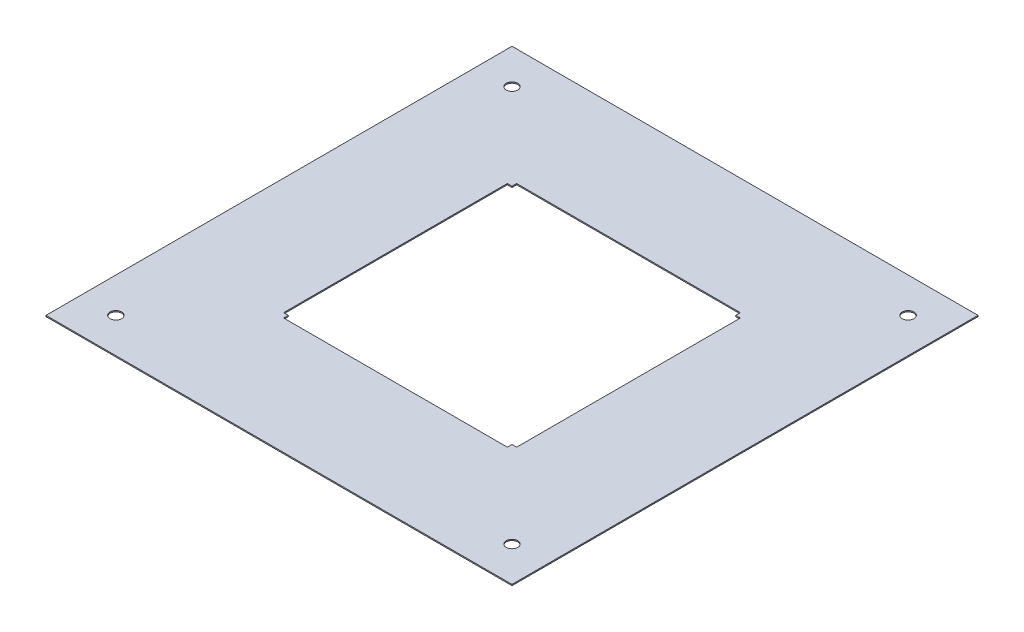
ISO-10303-21;
HEADER;
FILE_DESCRIPTION(('STEP AP214'),'2;1');
FILE_NAME('part.step','',(''),(''),'','','');
FILE_SCHEMA(('AUTOMOTIVE_DESIGN { 1 0 10303 214 1 1 1 1 }'));
ENDSEC;
DATA;
#1=APPLICATION_CONTEXT('core data for automotive mechanical design processes');
#2=APPLICATION_PROTOCOL_DEFINITION('international standard','automotive_design',2000,#1);
#3=PRODUCT_CONTEXT('',#1,'mechanical');
#4=PRODUCT('Part','Part','',(#3));
#5=PRODUCT_RELATED_PRODUCT_CATEGORY('part','',(#4));
#6=PRODUCT_DEFINITION_FORMATION('','',#4);
#7=PRODUCT_DEFINITION_CONTEXT('part definition',#1,'design');
#8=PRODUCT_DEFINITION('design','',#6,#7);
#9=PRODUCT_DEFINITION_SHAPE('','',#8);
#10=(LENGTH_UNIT() NAMED_UNIT(*) SI_UNIT(.MILLI.,.METRE.));
#11=(NAMED_UNIT(*) PLANE_ANGLE_UNIT() SI_UNIT($,.RADIAN.));
#12=(NAMED_UNIT(*) SI_UNIT($,.STERADIAN.) SOLID_ANGLE_UNIT());
#13=UNCERTAINTY_MEASURE_WITH_UNIT(LENGTH_MEASURE(1.E-05),#10,'distance_accuracy_value','');
#14=(GEOMETRIC_REPRESENTATION_CONTEXT(3) GLOBAL_UNCERTAINTY_ASSIGNED_CONTEXT((#13)) GLOBAL_UNIT_ASSIGNED_CONTEXT((#10,
#11,#12)) REPRESENTATION_CONTEXT('',''));
#15=CARTESIAN_POINT('',(0.,0.,0.));
#16=DIRECTION('',(0.,0.,1.));
#17=DIRECTION('',(1.,0.,0.));
#18=AXIS2_PLACEMENT_3D('',#15,#16,#17);
#19=CARTESIAN_POINT('',(0.,0.5,0.));
#20=DIRECTION('',(0.,-1.,0.));
#21=DIRECTION('',(0.,0.,-1.));
#22=AXIS2_PLACEMENT_3D('',#19,#20,#21);
#23=PLANE('',#22);
#24=DIRECTION('',(-1.,0.,0.));
#25=VECTOR('',#24,1.);
#26=CARTESIAN_POINT('',(50.,0.5,-148.));
#27=LINE('',#26,#25);
#28=CARTESIAN_POINT('',(52.,0.5,-148.));
#29=VERTEX_POINT('',#28);
#30=CARTESIAN_POINT('',(50.,0.5,-148.));
#31=VERTEX_POINT('',#30);
#32=EDGE_CURVE('E157',#29,#31,#27,.T.);
#33=ORIENTED_EDGE('',*,*,#32,.F.);
#34=DIRECTION('',(0.,0.,1.));
#35=VECTOR('',#34,1.);
#36=CARTESIAN_POINT('',(52.,0.5,-150.));
#37=LINE('',#36,#35);
#38=CARTESIAN_POINT('',(52.,0.5,-150.));
#39=VERTEX_POINT('',#38);
#40=EDGE_CURVE('E48',#39,#29,#37,.T.);
#41=ORIENTED_EDGE('',*,*,#40,.F.);
#42=DIRECTION('',(-1.,0.,0.));
#43=VECTOR('',#42,1.);
#44=CARTESIAN_POINT('',(52.,0.5,-150.));
#45=LINE('',#44,#43);
#46=CARTESIAN_POINT('',(148.,0.5,-150.));
#47=VERTEX_POINT('',#46);
#48=EDGE_CURVE('E190',#47,#39,#45,.T.);
#49=ORIENTED_EDGE('',*,*,#48,.F.);
#50=DIRECTION('',(0.,0.,-1.));
#51=VECTOR('',#50,1.);
#52=CARTESIAN_POINT('',(148.,0.5,-150.));
#53=LINE('',#52,#51);
#54=CARTESIAN_POINT('',(148.,0.5,-148.));
#55=VERTEX_POINT('',#54);
#56=EDGE_CURVE('E187',#55,#47,#53,.T.);
#57=ORIENTED_EDGE('',*,*,#56,.F.);
#58=DIRECTION('',(-1.,0.,0.));
#59=VECTOR('',#58,1.);
#60=CARTESIAN_POINT('',(150.,0.5,-148.));
#61=LINE('',#60,#59);
#62=CARTESIAN_POINT('',(150.,0.5,-148.));
#63=VERTEX_POINT('',#62);
#64=EDGE_CURVE('E184',#63,#55,#61,.T.);
#65=ORIENTED_EDGE('',*,*,#64,.F.);
#66=DIRECTION('',(0.,0.,-1.));
#67=VECTOR('',#66,1.);
#68=CARTESIAN_POINT('',(150.,0.5,-148.));
#69=LINE('',#68,#67);
#70=CARTESIAN_POINT('',(150.,0.5,-52.));
#71=VERTEX_POINT('',#70);
#72=EDGE_CURVE('E181',#71,#63,#69,.T.);
#73=ORIENTED_EDGE('',*,*,#72,.F.);
#74=DIRECTION('',(1.,0.,0.));
#75=VECTOR('',#74,1.);
#76=CARTESIAN_POINT('',(150.,0.5,-52.));
#77=LINE('',#76,#75);
#78=CARTESIAN_POINT('',(148.,0.5,-52.));
#79=VERTEX_POINT('',#78);
#80=EDGE_CURVE('E178',#79,#71,#77,.T.);
#81=ORIENTED_EDGE('',*,*,#80,.F.);
#82=DIRECTION('',(0.,0.,-1.));
#83=VECTOR('',#82,1.);
#84=CARTESIAN_POINT('',(148.,0.5,-50.));
#85=LINE('',#84,#83);
#86=CARTESIAN_POINT('',(148.,0.5,-50.));
#87=VERTEX_POINT('',#86);
#88=EDGE_CURVE('E175',#87,#79,#85,.T.);
#89=ORIENTED_EDGE('',*,*,#88,.F.);
#90=DIRECTION('',(1.,0.,0.));
#91=VECTOR('',#90,1.);
#92=CARTESIAN_POINT('',(148.,0.5,-50.));
#93=LINE('',#92,#91);
#94=CARTESIAN_POINT('',(52.,0.5,-49.9999999999992));
#95=VERTEX_POINT('',#94);
#96=EDGE_CURVE('E172',#95,#87,#93,.T.);
#97=ORIENTED_EDGE('',*,*,#96,.F.);
#98=DIRECTION('',(0.,0.,1.));
#99=VECTOR('',#98,1.);
#100=CARTESIAN_POINT('',(52.,0.5,-49.9999999999992));
#101=LINE('',#100,#99);
#102=CARTESIAN_POINT('',(52.,0.5,-51.9999999999992));
#103=VERTEX_POINT('',#102);
#104=EDGE_CURVE('E166',#103,#95,#101,.T.);
#105=ORIENTED_EDGE('',*,*,#104,.F.);
#106=DIRECTION('',(1.,0.,0.));
#107=VECTOR('',#106,1.);
#108=CARTESIAN_POINT('',(50.,0.5,-51.9999999999992));
#109=LINE('',#108,#107);
#110=CARTESIAN_POINT('',(50.,0.5,-51.9999999999992));
#111=VERTEX_POINT('',#110);
#112=EDGE_CURVE('E164',#111,#103,#109,.T.);
#113=ORIENTED_EDGE('',*,*,#112,.F.);
#114=DIRECTION('',(0.,0.,1.));
#115=VECTOR('',#114,1.);
#116=CARTESIAN_POINT('',(50.,0.5,-51.9999999999992));
#117=LINE('',#116,#115);
#118=EDGE_CURVE('E148',#31,#111,#117,.T.);
#119=ORIENTED_EDGE('',*,*,#118,.F.);
#120=EDGE_LOOP('',(#33,#41,#49,#57,#65,#73,#81,#89,#97,#105,#113,#119));
#121=FACE_BOUND('',#120,.T.);
#122=DIRECTION('',(0.,0.,1.));
#123=VECTOR('',#122,1.);
#124=CARTESIAN_POINT('',(0.,0.5,0.));
#125=LINE('',#124,#123);
#126=CARTESIAN_POINT('',(0.,0.5,-200.));
#127=VERTEX_POINT('',#126);
#128=CARTESIAN_POINT('',(0.,0.5,0.));
#129=VERTEX_POINT('',#128);
#130=EDGE_CURVE('E238',#127,#129,#125,.T.);
#131=ORIENTED_EDGE('',*,*,#130,.T.);
#132=DIRECTION('',(1.,0.,0.));
#133=VECTOR('',#132,1.);
#134=CARTESIAN_POINT('',(0.,0.5,0.));
#135=LINE('',#134,#133);
#136=CARTESIAN_POINT('',(200.,0.5,0.));
#137=VERTEX_POINT('',#136);
#138=EDGE_CURVE('E241',#129,#137,#135,.T.);
#139=ORIENTED_EDGE('',*,*,#138,.T.);
#140=DIRECTION('',(0.,0.,-1.));
#141=VECTOR('',#140,1.);
#142=CARTESIAN_POINT('',(200.,0.5,0.));
#143=LINE('',#142,#141);
#144=CARTESIAN_POINT('',(200.,0.5,-200.));
#145=VERTEX_POINT('',#144);
#146=EDGE_CURVE('E244',#137,#145,#143,.T.);
#147=ORIENTED_EDGE('',*,*,#146,.T.);
#148=DIRECTION('',(-1.,0.,0.));
#149=VECTOR('',#148,1.);
#150=CARTESIAN_POINT('',(0.,0.5,-200.));
#151=LINE('',#150,#149);
#152=EDGE_CURVE('E246',#145,#127,#151,.T.);
#153=ORIENTED_EDGE('',*,*,#152,.T.);
#154=EDGE_LOOP('',(#131,#139,#147,#153));
#155=FACE_BOUND('',#154,.T.);
#156=CARTESIAN_POINT('',(15.,0.5,-185.));
#157=DIRECTION('',(0.,1.,0.));
#158=DIRECTION('',(0.,0.,1.));
#159=AXIS2_PLACEMENT_3D('',#156,#157,#158);
#160=CIRCLE('',#159,2.5);
#161=CARTESIAN_POINT('',(15.,0.5,-182.5));
#162=VERTEX_POINT('',#161);
#163=EDGE_CURVE('E232',#162,#162,#160,.T.);
#164=ORIENTED_EDGE('',*,*,#163,.F.);
#165=EDGE_LOOP('',(#164));
#166=FACE_BOUND('',#165,.T.);
#167=CARTESIAN_POINT('',(185.,0.5,-185.));
#168=DIRECTION('',(0.,1.,0.));
#169=DIRECTION('',(0.,0.,1.));
#170=AXIS2_PLACEMENT_3D('',#167,#168,#169);
#171=CIRCLE('',#170,2.5);
#172=CARTESIAN_POINT('',(185.,0.5,-182.5));
#173=VERTEX_POINT('',#172);
#174=EDGE_CURVE('E226',#173,#173,#171,.T.);
#175=ORIENTED_EDGE('',*,*,#174,.F.);
#176=EDGE_LOOP('',(#175));
#177=FACE_BOUND('',#176,.T.);
#178=CARTESIAN_POINT('',(185.,0.5,-15.0000000000001));
#179=DIRECTION('',(0.,1.,0.));
#180=DIRECTION('',(0.,0.,1.));
#181=AXIS2_PLACEMENT_3D('',#178,#179,#180);
#182=CIRCLE('',#181,2.5);
#183=CARTESIAN_POINT('',(185.,0.5,-12.5000000000001));
#184=VERTEX_POINT('',#183);
#185=EDGE_CURVE('E220',#184,#184,#182,.T.);
#186=ORIENTED_EDGE('',*,*,#185,.F.);
#187=EDGE_LOOP('',(#186));
#188=FACE_BOUND('',#187,.T.);
#189=CARTESIAN_POINT('',(15.,0.5,-15.));
#190=DIRECTION('',(0.,1.,0.));
#191=DIRECTION('',(0.,0.,1.));
#192=AXIS2_PLACEMENT_3D('',#189,#190,#191);
#193=CIRCLE('',#192,2.5);
#194=CARTESIAN_POINT('',(15.,0.5,-12.5));
#195=VERTEX_POINT('',#194);
#196=EDGE_CURVE('E214',#195,#195,#193,.T.);
#197=ORIENTED_EDGE('',*,*,#196,.F.);
#198=EDGE_LOOP('',(#197));
#199=FACE_BOUND('',#198,.T.);
#200=ADVANCED_FACE('F33',(#121,#155,#166,#177,#188,#199),#23,.F.);
#201=CARTESIAN_POINT('',(0.,0.,0.));
#202=DIRECTION('',(0.,-1.,0.));
#203=DIRECTION('',(0.,0.,-1.));
#204=AXIS2_PLACEMENT_3D('',#201,#202,#203);
#205=PLANE('',#204);
#206=DIRECTION('',(0.,0.,-1.));
#207=VECTOR('',#206,1.);
#208=CARTESIAN_POINT('',(51.9999999999989,0.,3.60822483003168E-13));
#209=LINE('',#208,#207);
#210=CARTESIAN_POINT('',(52.,0.,-148.));
#211=VERTEX_POINT('',#210);
#212=CARTESIAN_POINT('',(52.,0.,-150.));
#213=VERTEX_POINT('',#212);
#214=EDGE_CURVE('E11',#211,#213,#209,.T.);
#215=ORIENTED_EDGE('',*,*,#214,.F.);
#216=DIRECTION('',(1.,0.,0.));
#217=VECTOR('',#216,1.);
#218=CARTESIAN_POINT('',(0.,0.,-148.));
#219=LINE('',#218,#217);
#220=CARTESIAN_POINT('',(50.,0.,-148.));
#221=VERTEX_POINT('',#220);
#222=EDGE_CURVE('E267',#221,#211,#219,.T.);
#223=ORIENTED_EDGE('',*,*,#222,.F.);
#224=DIRECTION('',(0.,0.,-1.));
#225=VECTOR('',#224,1.);
#226=CARTESIAN_POINT('',(50.0000000000001,0.,0.));
#227=LINE('',#226,#225);
#228=CARTESIAN_POINT('',(50.,0.,-51.9999999999992));
#229=VERTEX_POINT('',#228);
#230=EDGE_CURVE('E151',#229,#221,#227,.T.);
#231=ORIENTED_EDGE('',*,*,#230,.F.);
#232=DIRECTION('',(-1.,0.,0.));
#233=VECTOR('',#232,1.);
#234=CARTESIAN_POINT('',(0.,0.,-51.9999999999992));
#235=LINE('',#234,#233);
#236=CARTESIAN_POINT('',(52.,0.,-51.9999999999992));
#237=VERTEX_POINT('',#236);
#238=EDGE_CURVE('E270',#237,#229,#235,.T.);
#239=ORIENTED_EDGE('',*,*,#238,.F.);
#240=DIRECTION('',(0.,0.,-1.));
#241=VECTOR('',#240,1.);
#242=CARTESIAN_POINT('',(52.,0.,0.));
#243=LINE('',#242,#241);
#244=CARTESIAN_POINT('',(52.,0.,-49.9999999999992));
#245=VERTEX_POINT('',#244);
#246=EDGE_CURVE('E272',#245,#237,#243,.T.);
#247=ORIENTED_EDGE('',*,*,#246,.F.);
#248=DIRECTION('',(-1.,0.,0.));
#249=VECTOR('',#248,1.);
#250=CARTESIAN_POINT('',(0.,0.,-50.));
#251=LINE('',#250,#249);
#252=CARTESIAN_POINT('',(148.,0.,-50.));
#253=VERTEX_POINT('',#252);
#254=EDGE_CURVE('E274',#253,#245,#251,.T.);
#255=ORIENTED_EDGE('',*,*,#254,.F.);
#256=DIRECTION('',(0.,0.,1.));
#257=VECTOR('',#256,1.);
#258=CARTESIAN_POINT('',(147.999999999999,0.,2.05391259555653E-12));
#259=LINE('',#258,#257);
#260=CARTESIAN_POINT('',(148.,0.,-52.));
#261=VERTEX_POINT('',#260);
#262=EDGE_CURVE('E276',#261,#253,#259,.T.);
#263=ORIENTED_EDGE('',*,*,#262,.F.);
#264=DIRECTION('',(-1.,0.,0.));
#265=VECTOR('',#264,1.);
#266=CARTESIAN_POINT('',(0.,0.,-52.));
#267=LINE('',#266,#265);
#268=CARTESIAN_POINT('',(150.,0.,-52.));
#269=VERTEX_POINT('',#268);
#270=EDGE_CURVE('E278',#269,#261,#267,.T.);
#271=ORIENTED_EDGE('',*,*,#270,.F.);
#272=DIRECTION('',(0.,0.,1.));
#273=VECTOR('',#272,1.);
#274=CARTESIAN_POINT('',(150.,0.,-1.73472347597681E-13));
#275=LINE('',#274,#273);
#276=CARTESIAN_POINT('',(150.,0.,-148.));
#277=VERTEX_POINT('',#276);
#278=EDGE_CURVE('E280',#277,#269,#275,.T.);
#279=ORIENTED_EDGE('',*,*,#278,.F.);
#280=DIRECTION('',(1.,0.,0.));
#281=VECTOR('',#280,1.);
#282=CARTESIAN_POINT('',(2.05391259555657E-12,0.,-148.000000000002));
#283=LINE('',#282,#281);
#284=CARTESIAN_POINT('',(148.,0.,-148.));
#285=VERTEX_POINT('',#284);
#286=EDGE_CURVE('E282',#285,#277,#283,.T.);
#287=ORIENTED_EDGE('',*,*,#286,.F.);
#288=DIRECTION('',(0.,0.,1.));
#289=VECTOR('',#288,1.);
#290=CARTESIAN_POINT('',(148.,0.,0.));
#291=LINE('',#290,#289);
#292=CARTESIAN_POINT('',(148.,0.,-150.));
#293=VERTEX_POINT('',#292);
#294=EDGE_CURVE('E284',#293,#285,#291,.T.);
#295=ORIENTED_EDGE('',*,*,#294,.F.);
#296=DIRECTION('',(1.,0.,0.));
#297=VECTOR('',#296,1.);
#298=CARTESIAN_POINT('',(-1.73472347597681E-13,0.,-150.));
#299=LINE('',#298,#297);
#300=EDGE_CURVE('E41',#213,#293,#299,.T.);
#301=ORIENTED_EDGE('',*,*,#300,.F.);
#302=EDGE_LOOP('',(#215,#223,#231,#239,#247,#255,#263,#271,#279,#287,#295,#301));
#303=FACE_BOUND('',#302,.T.);
#304=CARTESIAN_POINT('',(185.,0.,-15.0000000000001));
#305=DIRECTION('',(0.,1.,0.));
#306=DIRECTION('',(0.,0.,1.));
#307=AXIS2_PLACEMENT_3D('',#304,#305,#306);
#308=CIRCLE('',#307,2.5);
#309=CARTESIAN_POINT('',(185.,0.,-12.5000000000001));
#310=VERTEX_POINT('',#309);
#311=EDGE_CURVE('E217',#310,#310,#308,.T.);
#312=ORIENTED_EDGE('',*,*,#311,.T.);
#313=EDGE_LOOP('',(#312));
#314=FACE_BOUND('',#313,.T.);
#315=CARTESIAN_POINT('',(15.,0.,-185.));
#316=DIRECTION('',(0.,1.,0.));
#317=DIRECTION('',(0.,0.,1.));
#318=AXIS2_PLACEMENT_3D('',#315,#316,#317);
#319=CIRCLE('',#318,2.5);
#320=CARTESIAN_POINT('',(15.,0.,-182.5));
#321=VERTEX_POINT('',#320);
#322=EDGE_CURVE('E229',#321,#321,#319,.T.);
#323=ORIENTED_EDGE('',*,*,#322,.T.);
#324=EDGE_LOOP('',(#323));
#325=FACE_BOUND('',#324,.T.);
#326=DIRECTION('',(0.,0.,1.));
#327=VECTOR('',#326,1.);
#328=CARTESIAN_POINT('',(0.,0.,0.));
#329=LINE('',#328,#327);
#330=CARTESIAN_POINT('',(0.,0.,-200.));
#331=VERTEX_POINT('',#330);
#332=CARTESIAN_POINT('',(0.,0.,0.));
#333=VERTEX_POINT('',#332);
#334=EDGE_CURVE('E235',#331,#333,#329,.T.);
#335=ORIENTED_EDGE('',*,*,#334,.F.);
#336=DIRECTION('',(-1.,0.,0.));
#337=VECTOR('',#336,1.);
#338=CARTESIAN_POINT('',(0.,0.,-200.));
#339=LINE('',#338,#337);
#340=CARTESIAN_POINT('',(200.,0.,-200.));
#341=VERTEX_POINT('',#340);
#342=EDGE_CURVE('E242',#341,#331,#339,.T.);
#343=ORIENTED_EDGE('',*,*,#342,.F.);
#344=DIRECTION('',(0.,0.,-1.));
#345=VECTOR('',#344,1.);
#346=CARTESIAN_POINT('',(200.,0.,0.));
#347=LINE('',#346,#345);
#348=CARTESIAN_POINT('',(200.,0.,0.));
#349=VERTEX_POINT('',#348);
#350=EDGE_CURVE('E253',#349,#341,#347,.T.);
#351=ORIENTED_EDGE('',*,*,#350,.F.);
#352=DIRECTION('',(1.,0.,0.));
#353=VECTOR('',#352,1.);
#354=CARTESIAN_POINT('',(0.,0.,0.));
#355=LINE('',#354,#353);
#356=EDGE_CURVE('E251',#333,#349,#355,.T.);
#357=ORIENTED_EDGE('',*,*,#356,.F.);
#358=EDGE_LOOP('',(#335,#343,#351,#357));
#359=FACE_BOUND('',#358,.T.);
#360=CARTESIAN_POINT('',(185.,0.,-185.));
#361=DIRECTION('',(0.,1.,0.));
#362=DIRECTION('',(0.,0.,1.));
#363=AXIS2_PLACEMENT_3D('',#360,#361,#362);
#364=CIRCLE('',#363,2.5);
#365=CARTESIAN_POINT('',(185.,0.,-182.5));
#366=VERTEX_POINT('',#365);
#367=EDGE_CURVE('E223',#366,#366,#364,.T.);
#368=ORIENTED_EDGE('',*,*,#367,.T.);
#369=EDGE_LOOP('',(#368));
#370=FACE_BOUND('',#369,.T.);
#371=CARTESIAN_POINT('',(15.,0.,-15.));
#372=DIRECTION('',(0.,1.,0.));
#373=DIRECTION('',(0.,0.,1.));
#374=AXIS2_PLACEMENT_3D('',#371,#372,#373);
#375=CIRCLE('',#374,2.5);
#376=CARTESIAN_POINT('',(15.,0.,-12.5));
#377=VERTEX_POINT('',#376);
#378=EDGE_CURVE('E195',#377,#377,#375,.T.);
#379=ORIENTED_EDGE('',*,*,#378,.T.);
#380=EDGE_LOOP('',(#379));
#381=FACE_BOUND('',#380,.T.);
#382=ADVANCED_FACE('F299',(#303,#314,#325,#359,#370,#381),#205,.T.);
#383=CARTESIAN_POINT('',(0.,0.5,0.));
#384=DIRECTION('',(1.,0.,0.));
#385=DIRECTION('',(0.,0.,-1.));
#386=AXIS2_PLACEMENT_3D('',#383,#384,#385);
#387=PLANE('',#386);
#388=ORIENTED_EDGE('',*,*,#334,.T.);
#389=DIRECTION('',(0.,-1.,0.));
#390=VECTOR('',#389,1.);
#391=CARTESIAN_POINT('',(0.,0.5,0.));
#392=LINE('',#391,#390);
#393=EDGE_CURVE('E264',#129,#333,#392,.T.);
#394=ORIENTED_EDGE('',*,*,#393,.F.);
#395=ORIENTED_EDGE('',*,*,#130,.F.);
#396=DIRECTION('',(0.,-1.,0.));
#397=VECTOR('',#396,1.);
#398=CARTESIAN_POINT('',(0.,0.5,-200.));
#399=LINE('',#398,#397);
#400=EDGE_CURVE('E248',#127,#331,#399,.T.);
#401=ORIENTED_EDGE('',*,*,#400,.T.);
#402=EDGE_LOOP('',(#388,#394,#395,#401));
#403=FACE_BOUND('',#402,.T.);
#404=ADVANCED_FACE('F35',(#403),#387,.F.);
#405=CARTESIAN_POINT('',(0.,0.5,0.));
#406=DIRECTION('',(0.,0.,-1.));
#407=DIRECTION('',(-1.,0.,0.));
#408=AXIS2_PLACEMENT_3D('',#405,#406,#407);
#409=PLANE('',#408);
#410=ORIENTED_EDGE('',*,*,#356,.T.);
#411=DIRECTION('',(0.,-1.,0.));
#412=VECTOR('',#411,1.);
#413=CARTESIAN_POINT('',(200.,0.5,0.));
#414=LINE('',#413,#412);
#415=EDGE_CURVE('E261',#137,#349,#414,.T.);
#416=ORIENTED_EDGE('',*,*,#415,.F.);
#417=ORIENTED_EDGE('',*,*,#138,.F.);
#418=ORIENTED_EDGE('',*,*,#393,.T.);
#419=EDGE_LOOP('',(#410,#416,#417,#418));
#420=FACE_BOUND('',#419,.T.);
#421=ADVANCED_FACE('F361',(#420),#409,.F.);
#422=CARTESIAN_POINT('',(200.,0.5,0.));
#423=DIRECTION('',(-1.,0.,0.));
#424=DIRECTION('',(0.,0.,1.));
#425=AXIS2_PLACEMENT_3D('',#422,#423,#424);
#426=PLANE('',#425);
#427=ORIENTED_EDGE('',*,*,#350,.T.);
#428=DIRECTION('',(0.,-1.,0.));
#429=VECTOR('',#428,1.);
#430=CARTESIAN_POINT('',(200.,0.5,-200.));
#431=LINE('',#430,#429);
#432=EDGE_CURVE('E258',#145,#341,#431,.T.);
#433=ORIENTED_EDGE('',*,*,#432,.F.);
#434=ORIENTED_EDGE('',*,*,#146,.F.);
#435=ORIENTED_EDGE('',*,*,#415,.T.);
#436=EDGE_LOOP('',(#427,#433,#434,#435));
#437=FACE_BOUND('',#436,.T.);
#438=ADVANCED_FACE('F358',(#437),#426,.F.);
#439=CARTESIAN_POINT('',(0.,0.5,-200.));
#440=DIRECTION('',(0.,0.,1.));
#441=DIRECTION('',(1.,0.,0.));
#442=AXIS2_PLACEMENT_3D('',#439,#440,#441);
#443=PLANE('',#442);
#444=ORIENTED_EDGE('',*,*,#342,.T.);
#445=ORIENTED_EDGE('',*,*,#400,.F.);
#446=ORIENTED_EDGE('',*,*,#152,.F.);
#447=ORIENTED_EDGE('',*,*,#432,.T.);
#448=EDGE_LOOP('',(#444,#445,#446,#447));
#449=FACE_BOUND('',#448,.T.);
#450=ADVANCED_FACE('F355',(#449),#443,.F.);
#451=CARTESIAN_POINT('',(15.,0.5,-185.));
#452=DIRECTION('',(0.,-1.,0.));
#453=DIRECTION('',(0.,0.,-1.));
#454=AXIS2_PLACEMENT_3D('',#451,#452,#453);
#455=CYLINDRICAL_SURFACE('',#454,2.5);
#456=ORIENTED_EDGE('',*,*,#163,.T.);
#457=EDGE_LOOP('',(#456));
#458=FACE_BOUND('',#457,.T.);
#459=ORIENTED_EDGE('',*,*,#322,.F.);
#460=EDGE_LOOP('',(#459));
#461=FACE_BOUND('',#460,.T.);
#462=ADVANCED_FACE('F352',(#458,#461),#455,.F.);
#463=CARTESIAN_POINT('',(185.,0.5,-185.));
#464=DIRECTION('',(0.,-1.,0.));
#465=DIRECTION('',(0.,0.,-1.));
#466=AXIS2_PLACEMENT_3D('',#463,#464,#465);
#467=CYLINDRICAL_SURFACE('',#466,2.5);
#468=ORIENTED_EDGE('',*,*,#174,.T.);
#469=EDGE_LOOP('',(#468));
#470=FACE_BOUND('',#469,.T.);
#471=ORIENTED_EDGE('',*,*,#367,.F.);
#472=EDGE_LOOP('',(#471));
#473=FACE_BOUND('',#472,.T.);
#474=ADVANCED_FACE('F395',(#470,#473),#467,.F.);
#475=CARTESIAN_POINT('',(185.,0.5,-15.0000000000001));
#476=DIRECTION('',(0.,-1.,0.));
#477=DIRECTION('',(0.,0.,-1.));
#478=AXIS2_PLACEMENT_3D('',#475,#476,#477);
#479=CYLINDRICAL_SURFACE('',#478,2.5);
#480=ORIENTED_EDGE('',*,*,#185,.T.);
#481=EDGE_LOOP('',(#480));
#482=FACE_BOUND('',#481,.T.);
#483=ORIENTED_EDGE('',*,*,#311,.F.);
#484=EDGE_LOOP('',(#483));
#485=FACE_BOUND('',#484,.T.);
#486=ADVANCED_FACE('F341',(#482,#485),#479,.F.);
#487=CARTESIAN_POINT('',(15.,0.5,-15.));
#488=DIRECTION('',(0.,-1.,0.));
#489=DIRECTION('',(0.,0.,-1.));
#490=AXIS2_PLACEMENT_3D('',#487,#488,#489);
#491=CYLINDRICAL_SURFACE('',#490,2.5);
#492=ORIENTED_EDGE('',*,*,#196,.T.);
#493=EDGE_LOOP('',(#492));
#494=FACE_BOUND('',#493,.T.);
#495=ORIENTED_EDGE('',*,*,#378,.F.);
#496=EDGE_LOOP('',(#495));
#497=FACE_BOUND('',#496,.T.);
#498=ADVANCED_FACE('F334',(#494,#497),#491,.F.);
#499=CARTESIAN_POINT('',(52.,-9.5,-150.));
#500=DIRECTION('',(-1.,0.,0.));
#501=DIRECTION('',(0.,0.,1.));
#502=AXIS2_PLACEMENT_3D('',#499,#500,#501);
#503=PLANE('',#502);
#504=ORIENTED_EDGE('',*,*,#214,.T.);
#505=DIRECTION('',(0.,1.,0.));
#506=VECTOR('',#505,1.);
#507=CARTESIAN_POINT('',(52.,-9.5,-150.));
#508=LINE('',#507,#506);
#509=EDGE_CURVE('E193',#213,#39,#508,.T.);
#510=ORIENTED_EDGE('',*,*,#509,.T.);
#511=ORIENTED_EDGE('',*,*,#40,.T.);
#512=DIRECTION('',(0.,1.,0.));
#513=VECTOR('',#512,1.);
#514=CARTESIAN_POINT('',(52.,-9.5,-148.));
#515=LINE('',#514,#513);
#516=EDGE_CURVE('E154',#211,#29,#515,.T.);
#517=ORIENTED_EDGE('',*,*,#516,.F.);
#518=EDGE_LOOP('',(#504,#510,#511,#517));
#519=FACE_BOUND('',#518,.T.);
#520=ADVANCED_FACE('F332',(#519),#503,.F.);
#521=CARTESIAN_POINT('',(52.,-9.5,-150.));
#522=DIRECTION('',(0.,0.,-1.));
#523=DIRECTION('',(-1.,0.,0.));
#524=AXIS2_PLACEMENT_3D('',#521,#522,#523);
#525=PLANE('',#524);
#526=ORIENTED_EDGE('',*,*,#300,.T.);
#527=DIRECTION('',(0.,1.,0.));
#528=VECTOR('',#527,1.);
#529=CARTESIAN_POINT('',(148.,-9.5,-150.));
#530=LINE('',#529,#528);
#531=EDGE_CURVE('E196',#293,#47,#530,.T.);
#532=ORIENTED_EDGE('',*,*,#531,.T.);
#533=ORIENTED_EDGE('',*,*,#48,.T.);
#534=ORIENTED_EDGE('',*,*,#509,.F.);
#535=EDGE_LOOP('',(#526,#532,#533,#534));
#536=FACE_BOUND('',#535,.T.);
#537=ADVANCED_FACE('F289',(#536),#525,.F.);
#538=CARTESIAN_POINT('',(148.,-9.5,-150.));
#539=DIRECTION('',(1.,0.,0.));
#540=DIRECTION('',(0.,0.,-1.));
#541=AXIS2_PLACEMENT_3D('',#538,#539,#540);
#542=PLANE('',#541);
#543=ORIENTED_EDGE('',*,*,#294,.T.);
#544=DIRECTION('',(0.,1.,0.));
#545=VECTOR('',#544,1.);
#546=CARTESIAN_POINT('',(148.,-9.5,-148.));
#547=LINE('',#546,#545);
#548=EDGE_CURVE('E198',#285,#55,#547,.T.);
#549=ORIENTED_EDGE('',*,*,#548,.T.);
#550=ORIENTED_EDGE('',*,*,#56,.T.);
#551=ORIENTED_EDGE('',*,*,#531,.F.);
#552=EDGE_LOOP('',(#543,#549,#550,#551));
#553=FACE_BOUND('',#552,.T.);
#554=ADVANCED_FACE('F294',(#553),#542,.F.);
#555=CARTESIAN_POINT('',(150.,-9.5,-148.));
#556=DIRECTION('',(0.,0.,-1.));
#557=DIRECTION('',(-1.,0.,0.));
#558=AXIS2_PLACEMENT_3D('',#555,#556,#557);
#559=PLANE('',#558);
#560=ORIENTED_EDGE('',*,*,#286,.T.);
#561=DIRECTION('',(0.,1.,0.));
#562=VECTOR('',#561,1.);
#563=CARTESIAN_POINT('',(150.,-9.5,-148.));
#564=LINE('',#563,#562);
#565=EDGE_CURVE('E200',#277,#63,#564,.T.);
#566=ORIENTED_EDGE('',*,*,#565,.T.);
#567=ORIENTED_EDGE('',*,*,#64,.T.);
#568=ORIENTED_EDGE('',*,*,#548,.F.);
#569=EDGE_LOOP('',(#560,#566,#567,#568));
#570=FACE_BOUND('',#569,.T.);
#571=ADVANCED_FACE('F305',(#570),#559,.F.);
#572=CARTESIAN_POINT('',(150.,-9.5,-148.));
#573=DIRECTION('',(1.,0.,0.));
#574=DIRECTION('',(0.,0.,-1.));
#575=AXIS2_PLACEMENT_3D('',#572,#573,#574);
#576=PLANE('',#575);
#577=ORIENTED_EDGE('',*,*,#278,.T.);
#578=DIRECTION('',(0.,1.,0.));
#579=VECTOR('',#578,1.);
#580=CARTESIAN_POINT('',(150.,-9.5,-52.));
#581=LINE('',#580,#579);
#582=EDGE_CURVE('E202',#269,#71,#581,.T.);
#583=ORIENTED_EDGE('',*,*,#582,.T.);
#584=ORIENTED_EDGE('',*,*,#72,.T.);
#585=ORIENTED_EDGE('',*,*,#565,.F.);
#586=EDGE_LOOP('',(#577,#583,#584,#585));
#587=FACE_BOUND('',#586,.T.);
#588=ADVANCED_FACE('F307',(#587),#576,.F.);
#589=CARTESIAN_POINT('',(150.,-9.5,-52.));
#590=DIRECTION('',(0.,0.,1.));
#591=DIRECTION('',(1.,0.,0.));
#592=AXIS2_PLACEMENT_3D('',#589,#590,#591);
#593=PLANE('',#592);
#594=ORIENTED_EDGE('',*,*,#270,.T.);
#595=DIRECTION('',(0.,1.,0.));
#596=VECTOR('',#595,1.);
#597=CARTESIAN_POINT('',(148.,-9.5,-52.));
#598=LINE('',#597,#596);
#599=EDGE_CURVE('E204',#261,#79,#598,.T.);
#600=ORIENTED_EDGE('',*,*,#599,.T.);
#601=ORIENTED_EDGE('',*,*,#80,.T.);
#602=ORIENTED_EDGE('',*,*,#582,.F.);
#603=EDGE_LOOP('',(#594,#600,#601,#602));
#604=FACE_BOUND('',#603,.T.);
#605=ADVANCED_FACE('F315',(#604),#593,.F.);
#606=CARTESIAN_POINT('',(148.,-9.5,-50.));
#607=DIRECTION('',(1.,0.,0.));
#608=DIRECTION('',(0.,0.,-1.));
#609=AXIS2_PLACEMENT_3D('',#606,#607,#608);
#610=PLANE('',#609);
#611=ORIENTED_EDGE('',*,*,#262,.T.);
#612=DIRECTION('',(0.,1.,0.));
#613=VECTOR('',#612,1.);
#614=CARTESIAN_POINT('',(148.,-9.5,-50.));
#615=LINE('',#614,#613);
#616=EDGE_CURVE('E206',#253,#87,#615,.T.);
#617=ORIENTED_EDGE('',*,*,#616,.T.);
#618=ORIENTED_EDGE('',*,*,#88,.T.);
#619=ORIENTED_EDGE('',*,*,#599,.F.);
#620=EDGE_LOOP('',(#611,#617,#618,#619));
#621=FACE_BOUND('',#620,.T.);
#622=ADVANCED_FACE('F319',(#621),#610,.F.);
#623=CARTESIAN_POINT('',(148.,-9.5,-50.));
#624=DIRECTION('',(0.,0.,1.));
#625=DIRECTION('',(1.,0.,0.));
#626=AXIS2_PLACEMENT_3D('',#623,#624,#625);
#627=PLANE('',#626);
#628=ORIENTED_EDGE('',*,*,#254,.T.);
#629=DIRECTION('',(0.,1.,0.));
#630=VECTOR('',#629,1.);
#631=CARTESIAN_POINT('',(52.,-9.5,-49.9999999999992));
#632=LINE('',#631,#630);
#633=EDGE_CURVE('E208',#245,#95,#632,.T.);
#634=ORIENTED_EDGE('',*,*,#633,.T.);
#635=ORIENTED_EDGE('',*,*,#96,.T.);
#636=ORIENTED_EDGE('',*,*,#616,.F.);
#637=EDGE_LOOP('',(#628,#634,#635,#636));
#638=FACE_BOUND('',#637,.T.);
#639=ADVANCED_FACE('F323',(#638),#627,.F.);
#640=CARTESIAN_POINT('',(52.,-9.5,-49.9999999999992));
#641=DIRECTION('',(-1.,0.,0.));
#642=DIRECTION('',(0.,0.,1.));
#643=AXIS2_PLACEMENT_3D('',#640,#641,#642);
#644=PLANE('',#643);
#645=ORIENTED_EDGE('',*,*,#246,.T.);
#646=DIRECTION('',(0.,1.,0.));
#647=VECTOR('',#646,1.);
#648=CARTESIAN_POINT('',(52.,-9.5,-51.9999999999992));
#649=LINE('',#648,#647);
#650=EDGE_CURVE('E210',#237,#103,#649,.T.);
#651=ORIENTED_EDGE('',*,*,#650,.T.);
#652=ORIENTED_EDGE('',*,*,#104,.T.);
#653=ORIENTED_EDGE('',*,*,#633,.F.);
#654=EDGE_LOOP('',(#645,#651,#652,#653));
#655=FACE_BOUND('',#654,.T.);
#656=ADVANCED_FACE('F326',(#655),#644,.F.);
#657=CARTESIAN_POINT('',(50.,-9.5,-51.9999999999992));
#658=DIRECTION('',(0.,0.,1.));
#659=DIRECTION('',(1.,0.,0.));
#660=AXIS2_PLACEMENT_3D('',#657,#658,#659);
#661=PLANE('',#660);
#662=ORIENTED_EDGE('',*,*,#238,.T.);
#663=DIRECTION('',(0.,1.,0.));
#664=VECTOR('',#663,1.);
#665=CARTESIAN_POINT('',(50.,-9.5,-51.9999999999992));
#666=LINE('',#665,#664);
#667=EDGE_CURVE('E153',#229,#111,#666,.T.);
#668=ORIENTED_EDGE('',*,*,#667,.T.);
#669=ORIENTED_EDGE('',*,*,#112,.T.);
#670=ORIENTED_EDGE('',*,*,#650,.F.);
#671=EDGE_LOOP('',(#662,#668,#669,#670));
#672=FACE_BOUND('',#671,.T.);
#673=ADVANCED_FACE('F331',(#672),#661,.F.);
#674=CARTESIAN_POINT('',(50.,-9.5,-51.9999999999992));
#675=DIRECTION('',(-1.,0.,0.));
#676=DIRECTION('',(0.,0.,1.));
#677=AXIS2_PLACEMENT_3D('',#674,#675,#676);
#678=PLANE('',#677);
#679=ORIENTED_EDGE('',*,*,#230,.T.);
#680=DIRECTION('',(0.,1.,0.));
#681=VECTOR('',#680,1.);
#682=CARTESIAN_POINT('',(50.,-9.5,-148.));
#683=LINE('',#682,#681);
#684=EDGE_CURVE('E56',#221,#31,#683,.T.);
#685=ORIENTED_EDGE('',*,*,#684,.T.);
#686=ORIENTED_EDGE('',*,*,#118,.T.);
#687=ORIENTED_EDGE('',*,*,#667,.F.);
#688=EDGE_LOOP('',(#679,#685,#686,#687));
#689=FACE_BOUND('',#688,.T.);
#690=ADVANCED_FACE('F145',(#689),#678,.F.);
#691=CARTESIAN_POINT('',(50.,-9.5,-148.));
#692=DIRECTION('',(0.,0.,-1.));
#693=DIRECTION('',(-1.,0.,0.));
#694=AXIS2_PLACEMENT_3D('',#691,#692,#693);
#695=PLANE('',#694);
#696=ORIENTED_EDGE('',*,*,#222,.T.);
#697=ORIENTED_EDGE('',*,*,#516,.T.);
#698=ORIENTED_EDGE('',*,*,#32,.T.);
#699=ORIENTED_EDGE('',*,*,#684,.F.);
#700=EDGE_LOOP('',(#696,#697,#698,#699));
#701=FACE_BOUND('',#700,.T.);
#702=ADVANCED_FACE('F158',(#701),#695,.F.);
#703=CLOSED_SHELL('',(#200,#382,#404,#421,#438,#450,#462,#474,#486,#498,#520,#537,#554,#571,
#588,#605,#622,#639,#656,#673,#690,#702));
#704=MANIFOLD_SOLID_BREP('B2',#703);
#705=ADVANCED_BREP_SHAPE_REPRESENTATION('',(#18,#704),#14);
#706=SHAPE_DEFINITION_REPRESENTATION(#9,#705);
ENDSEC;
END-ISO-10303-21;
